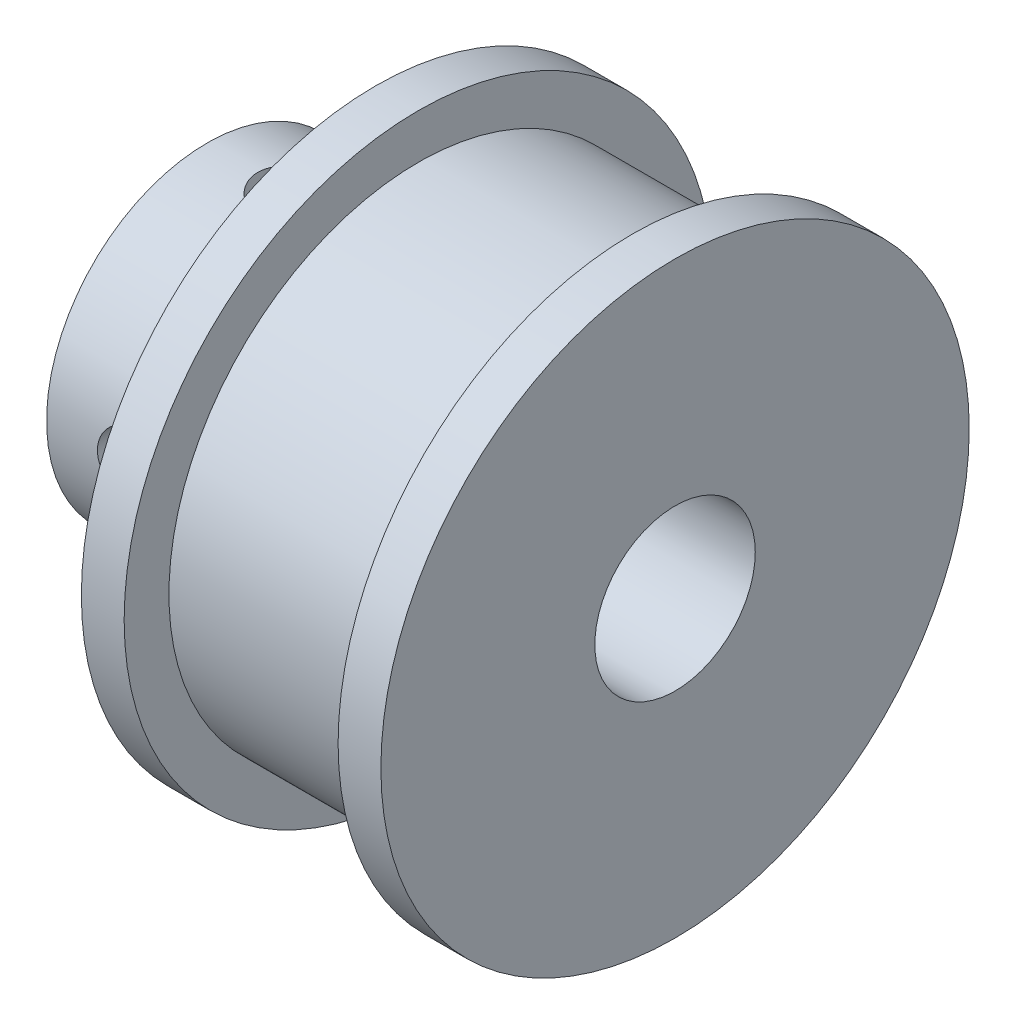
ISO-10303-21;
HEADER;
FILE_DESCRIPTION(('STEP AP214'),'2;1');
FILE_NAME('part.step','',(''),(''),'','','');
FILE_SCHEMA(('AUTOMOTIVE_DESIGN { 1 0 10303 214 1 1 1 1 }'));
ENDSEC;
DATA;
#1=APPLICATION_CONTEXT('core data for automotive mechanical design processes');
#2=APPLICATION_PROTOCOL_DEFINITION('international standard','automotive_design',2000,#1);
#3=PRODUCT_CONTEXT('',#1,'mechanical');
#4=PRODUCT('Part','Part','',(#3));
#5=PRODUCT_RELATED_PRODUCT_CATEGORY('part','',(#4));
#6=PRODUCT_DEFINITION_FORMATION('','',#4);
#7=PRODUCT_DEFINITION_CONTEXT('part definition',#1,'design');
#8=PRODUCT_DEFINITION('design','',#6,#7);
#9=PRODUCT_DEFINITION_SHAPE('','',#8);
#10=(LENGTH_UNIT() NAMED_UNIT(*) SI_UNIT(.MILLI.,.METRE.));
#11=(NAMED_UNIT(*) PLANE_ANGLE_UNIT() SI_UNIT($,.RADIAN.));
#12=(NAMED_UNIT(*) SI_UNIT($,.STERADIAN.) SOLID_ANGLE_UNIT());
#13=UNCERTAINTY_MEASURE_WITH_UNIT(LENGTH_MEASURE(1.E-05),#10,'distance_accuracy_value','');
#14=(GEOMETRIC_REPRESENTATION_CONTEXT(3) GLOBAL_UNCERTAINTY_ASSIGNED_CONTEXT((#13)) GLOBAL_UNIT_ASSIGNED_CONTEXT((#10,
#11,#12)) REPRESENTATION_CONTEXT('',''));
#15=CARTESIAN_POINT('',(0.,0.,0.));
#16=DIRECTION('',(0.,0.,1.));
#17=DIRECTION('',(1.,0.,0.));
#18=AXIS2_PLACEMENT_3D('',#15,#16,#17);
#19=CARTESIAN_POINT('',(0.,2.5,0.));
#20=DIRECTION('',(-1.,0.,0.));
#21=DIRECTION('',(0.,0.,1.));
#22=AXIS2_PLACEMENT_3D('',#19,#20,#21);
#23=PLANE('',#22);
#24=CARTESIAN_POINT('',(0.,0.,0.));
#25=DIRECTION('',(1.,0.,0.));
#26=DIRECTION('',(0.,0.,-1.));
#27=AXIS2_PLACEMENT_3D('',#24,#25,#26);
#28=CIRCLE('',#27,3.);
#29=CARTESIAN_POINT('',(0.,0.,-3.));
#30=VERTEX_POINT('',#29);
#31=EDGE_CURVE('E3315',#30,#30,#28,.T.);
#32=ORIENTED_EDGE('',*,*,#31,.T.);
#33=EDGE_LOOP('',(#32));
#34=FACE_BOUND('',#33,.T.);
#35=CARTESIAN_POINT('',(0.,0.,0.));
#36=DIRECTION('',(1.,0.,0.));
#37=DIRECTION('',(0.,0.,-1.));
#38=AXIS2_PLACEMENT_3D('',#35,#36,#37);
#39=CIRCLE('',#38,6.);
#40=CARTESIAN_POINT('',(0.,0.,-6.));
#41=VERTEX_POINT('',#40);
#42=EDGE_CURVE('E14',#41,#41,#39,.T.);
#43=ORIENTED_EDGE('',*,*,#42,.F.);
#44=EDGE_LOOP('',(#43));
#45=FACE_BOUND('',#44,.T.);
#46=ADVANCED_FACE('F3239',(#34,#45),#23,.T.);
#47=CARTESIAN_POINT('',(0.,0.,0.));
#48=DIRECTION('',(1.,0.,0.));
#49=DIRECTION('',(0.,0.,-1.));
#50=AXIS2_PLACEMENT_3D('',#47,#48,#49);
#51=CYLINDRICAL_SURFACE('',#50,6.);
#52=CARTESIAN_POINT('',(1.90000000000001,0.,6.));
#53=CARTESIAN_POINT('',(1.90000247746923,-0.0694090417016603,5.99999871526651));
#54=CARTESIAN_POINT('',(1.90580066571876,-0.138848789520875,5.99878328775043));
#55=CARTESIAN_POINT('',(1.92881934953286,-0.275761316266992,5.99405200990679));
#56=CARTESIAN_POINT('',(1.94604852303694,-0.343232560128311,5.99053441189248));
#57=CARTESIAN_POINT('',(1.99137045492183,-0.474209132291339,5.98159109196202));
#58=CARTESIAN_POINT('',(2.01945239599889,-0.537718336709182,5.97616727052645));
#59=CARTESIAN_POINT('',(2.08564960885619,-0.659120328605954,5.96399927809859));
#60=CARTESIAN_POINT('',(2.12376443115584,-0.717013367534323,5.95725516625975));
#61=CARTESIAN_POINT('',(2.20953634019065,-0.826390324308832,5.9430770002465));
#62=CARTESIAN_POINT('',(2.25731200123509,-0.87778024416268,5.93563505848531));
#63=CARTESIAN_POINT('',(2.36079465919511,-0.971877776769387,5.92095657692448));
#64=CARTESIAN_POINT('',(2.41650231187227,-1.01458467096098,5.91372005416683));
#65=CARTESIAN_POINT('',(2.53495196876616,-1.09051031677216,5.90019442595308));
#66=CARTESIAN_POINT('',(2.59775838450275,-1.1236305468065,5.89391545174828));
#67=CARTESIAN_POINT('',(2.72819745177276,-1.17881119348063,5.8831284065002));
#68=CARTESIAN_POINT('',(2.79582958244254,-1.20087280167641,5.87862014467568));
#69=CARTESIAN_POINT('',(2.93298523741564,-1.23300240133736,5.87196500986123));
#70=CARTESIAN_POINT('',(3.00246835933477,-1.24323597696798,5.86978556855865));
#71=CARTESIAN_POINT('',(3.14219684286263,-1.25193357655614,5.86793690716491));
#72=CARTESIAN_POINT('',(3.2124421188653,-1.25039890894686,5.86826740800981));
#73=CARTESIAN_POINT('',(3.35048102797518,-1.23573719037196,5.87137174319175));
#74=CARTESIAN_POINT('',(3.41829597966121,-1.2228010523272,5.87410533679901));
#75=CARTESIAN_POINT('',(3.55077150964493,-1.18600543529945,5.88164437615942));
#76=CARTESIAN_POINT('',(3.61543192560633,-1.16214539481381,5.88644992841317));
#77=CARTESIAN_POINT('',(3.74030722841598,-1.10400003213928,5.89763191464102));
#78=CARTESIAN_POINT('',(3.80048629652707,-1.06964002534236,5.90401953785586));
#79=CARTESIAN_POINT('',(3.91429574426816,-0.991522699274812,5.91763890010721));
#80=CARTESIAN_POINT('',(3.96792530883597,-0.947764212262582,5.92487074398537));
#81=CARTESIAN_POINT('',(4.06821396108037,-0.851074921546777,5.93953730929909));
#82=CARTESIAN_POINT('',(4.11471616889701,-0.797981433412077,5.94697323199473));
#83=CARTESIAN_POINT('',(4.19818044222897,-0.684667288611794,5.96108088143001));
#84=CARTESIAN_POINT('',(4.23514236459839,-0.624446525025762,5.96775259670236));
#85=CARTESIAN_POINT('',(4.29851008153595,-0.498405541235475,5.97959870942815));
#86=CARTESIAN_POINT('',(4.32489680456711,-0.432575461926497,5.98477039710258));
#87=CARTESIAN_POINT('',(4.36619170483549,-0.297284620972153,5.99301338211281));
#88=CARTESIAN_POINT('',(4.38110139323139,-0.227824338595088,5.99608495596053));
#89=CARTESIAN_POINT('',(4.39879425206788,-0.0885918657008349,5.99974275215455));
#90=CARTESIAN_POINT('',(4.40179194149424,-0.0188480555261788,6.00037293537579));
#91=CARTESIAN_POINT('',(4.39615505003089,0.120143798757714,5.99919952252774));
#92=CARTESIAN_POINT('',(4.3875211813984,0.189391872962257,5.99739607548153));
#93=CARTESIAN_POINT('',(4.35904434653046,0.324726367119811,5.99158564979184));
#94=CARTESIAN_POINT('',(4.33931251461653,0.390837192894204,5.98760052868077));
#95=CARTESIAN_POINT('',(4.28932213957859,0.518811446661328,5.97787227242395));
#96=CARTESIAN_POINT('',(4.25906275913401,0.580674536336772,5.97212899744579));
#97=CARTESIAN_POINT('',(4.18841962176244,0.69929430694349,5.95941241490714));
#98=CARTESIAN_POINT('',(4.14790807043093,0.755973219469829,5.9524239381233));
#99=CARTESIAN_POINT('',(4.05808043692373,0.861805445886515,5.93802568299709));
#100=CARTESIAN_POINT('',(4.00876332448106,0.910957877913281,5.93061585542511));
#101=CARTESIAN_POINT('',(3.9017444230003,1.0011786486518,5.91606024531377));
#102=CARTESIAN_POINT('',(3.84391696804472,1.04209914600204,5.90892089307501));
#103=CARTESIAN_POINT('',(3.72208371578621,1.11364719079243,5.89585601015805));
#104=CARTESIAN_POINT('',(3.65807817586089,1.14427516677863,5.88993042894651));
#105=CARTESIAN_POINT('',(3.52603880370177,1.19417246443921,5.88001700708041));
#106=CARTESIAN_POINT('',(3.45802896283416,1.21350309828031,5.87601872784687));
#107=CARTESIAN_POINT('',(3.31963344950774,1.24044038523407,5.87039184709697));
#108=CARTESIAN_POINT('',(3.24924811838056,1.2480487154444,5.86876290660367));
#109=CARTESIAN_POINT('',(3.10958659900035,1.25125926487611,5.86807907308506));
#110=CARTESIAN_POINT('',(3.04031592977795,1.24709542622725,5.86897402321502));
#111=CARTESIAN_POINT('',(2.90348599107978,1.22739905314031,5.87312447254928));
#112=CARTESIAN_POINT('',(2.8359267051839,1.21186662782265,5.87637994909626));
#113=CARTESIAN_POINT('',(2.70460222810934,1.16998217768584,5.88486132447716));
#114=CARTESIAN_POINT('',(2.64082675351308,1.14366117568421,5.8900815700793));
#115=CARTESIAN_POINT('',(2.51856122397334,1.08097457299757,5.90190705738738));
#116=CARTESIAN_POINT('',(2.46007166036688,1.04460803983029,5.9085124276546));
#117=CARTESIAN_POINT('',(2.34887837292056,0.962073695342405,5.92251579551146));
#118=CARTESIAN_POINT('',(2.29630087543502,0.91573789041822,5.92992613868404));
#119=CARTESIAN_POINT('',(2.19959050677365,0.814924438115329,5.94461839583213));
#120=CARTESIAN_POINT('',(2.15545958244852,0.760444918832963,5.9519002798488));
#121=CARTESIAN_POINT('',(2.07641142681595,0.644134427507699,5.96561444547637));
#122=CARTESIAN_POINT('',(2.04160632011372,0.582225921521345,5.97203596073244));
#123=CARTESIAN_POINT('',(1.98294977156998,0.453319843998451,5.98319908494092));
#124=CARTESIAN_POINT('',(1.95908875281813,0.386326781907242,5.98794216182101));
#125=CARTESIAN_POINT('',(1.92745972171158,0.266015292900104,5.99432499781443));
#126=CARTESIAN_POINT('',(1.91718123679115,0.213367593727928,5.99644035661395));
#127=CARTESIAN_POINT('',(1.90345054572268,0.107152674176536,5.99927832789758));
#128=CARTESIAN_POINT('',(1.89999808733282,0.0535854878488715,6.00000099184586));
#129=CARTESIAN_POINT('',(1.90000000000001,0.,6.));
#130=B_SPLINE_CURVE_WITH_KNOTS('',3,(#52,#53,#54,#55,#56,#57,#58,#59,#60,#61,#62,#63,#64,#65,
#66,#67,#68,#69,#70,#71,#72,#73,#74,#75,#76,#77,#78,#79,#80,#81,#82,#83,#84,#85,#86,#87,#88,#89,
#90,#91,#92,#93,#94,#95,#96,#97,#98,#99,#100,#101,#102,#103,#104,#105,#106,#107,#108,#109,#110,
#111,#112,#113,#114,#115,#116,#117,#118,#119,#120,#121,#122,#123,#124,#125,#126,#127,#128,#129),
.UNSPECIFIED.,.T.,.F.,(4,2,2,2,2,2,2,2,2,2,2,2,2,2,2,2,2,2,2,2,2,2,2,2,2,2,2,2,2,2,2,2,2,2,2,2,
2,2,4),(0.,0.208031045103182,0.416220199906223,0.624202378825439,0.832175241572985,
1.04287526388122,1.25359271551785,1.46640449178548,1.67919333285489,1.88896575169853,
2.09871484767163,2.30501712129058,2.51133000030278,2.71914592416748,2.92698768368033,
3.13889526355464,3.35080602278216,3.5630972449966,3.77536051045769,3.98378339407673,
4.19219351552275,4.39855286632619,4.60492863390931,4.81401583995734,5.02312752564571,
5.23571263829333,5.44828889851306,5.65970050095022,5.87108185414182,6.07829223291035,
6.28550062281358,6.49211731393252,6.69875319081476,6.90919024830305,7.11967575117366,
7.33258864398252,7.54531486464969,7.70592588477276,7.86653096973387),.UNSPECIFIED.);
#131=CARTESIAN_POINT('',(1.90000000000001,0.,6.));
#132=VERTEX_POINT('',#131);
#133=EDGE_CURVE('E3265',#132,#132,#130,.T.);
#134=ORIENTED_EDGE('',*,*,#133,.F.);
#135=EDGE_LOOP('',(#134));
#136=FACE_BOUND('',#135,.T.);
#137=CARTESIAN_POINT('',(3.15,5.86834729715275,-1.25));
#138=CARTESIAN_POINT('',(3.08060938484897,5.86834869213645,-1.24999750877599));
#139=CARTESIAN_POINT('',(3.01118802798478,5.86959145924544,-1.24420229433948));
#140=CARTESIAN_POINT('',(2.87431368268275,5.87442015581798,-1.22119649233779));
#141=CARTESIAN_POINT('',(2.80686224449358,5.87800788138388,-1.20397715440342));
#142=CARTESIAN_POINT('',(2.67592762716513,5.8871029296193,-1.1586839750723));
#143=CARTESIAN_POINT('',(2.6124404040082,5.89260825706945,-1.13062141248932));
#144=CARTESIAN_POINT('',(2.4910755003544,5.90491581335741,-1.06446988601732));
#145=CARTESIAN_POINT('',(2.43319759326998,5.91171798977622,-1.0263813273582));
#146=CARTESIAN_POINT('',(2.32380462484654,5.92596934661468,-0.940636399466082));
#147=CARTESIAN_POINT('',(2.27238810637353,5.93342614373039,-0.892855554869668));
#148=CARTESIAN_POINT('',(2.1782389313519,5.94807966802575,-0.789351223880636));
#149=CARTESIAN_POINT('',(2.13550691170856,5.95527637609915,-0.733627155456002));
#150=CARTESIAN_POINT('',(2.05955411191714,5.96868135118848,-0.615162052999588));
#151=CARTESIAN_POINT('',(2.02642747353674,5.97487958631242,-0.552359428204941));
#152=CARTESIAN_POINT('',(1.97123394714022,5.98550347343302,-0.421928551006719));
#153=CARTESIAN_POINT('',(1.94916593484647,5.98992930561222,-0.354300789950591));
#154=CARTESIAN_POINT('',(1.91702423888253,5.99645589892179,-0.217162904200502));
#155=CARTESIAN_POINT('',(1.90678398280484,5.99858891959926,-0.147693380916357));
#156=CARTESIAN_POINT('',(1.89806830424298,6.00040112580612,-0.00799184883952432));
#157=CARTESIAN_POINT('',(1.8995916558069,6.0000805670369,0.0622400797368385));
#158=CARTESIAN_POINT('',(1.91423460095674,5.99704658090511,0.200326586199572));
#159=CARTESIAN_POINT('',(1.92717471895812,5.99437018956584,0.268201128726475));
#160=CARTESIAN_POINT('',(1.96399862533131,5.98696720898885,0.400793746289752));
#161=CARTESIAN_POINT('',(1.98788287720308,5.98224053291904,0.465511687511022));
#162=CARTESIAN_POINT('',(2.0460800521255,5.97120767323924,0.590460005384683));
#163=CARTESIAN_POINT('',(2.08046229420966,5.96489104125346,0.65065713498165));
#164=CARTESIAN_POINT('',(2.15862800284042,5.95137300440189,0.764493456510647));
#165=CARTESIAN_POINT('',(2.20241263820613,5.94417148958325,0.818131831816418));
#166=CARTESIAN_POINT('',(2.29912162489106,5.92951700233276,0.918394203276912));
#167=CARTESIAN_POINT('',(2.35220305998195,5.92206184975925,0.964866487494794));
#168=CARTESIAN_POINT('',(2.4654820489948,5.90786872648996,1.04827597240488));
#169=CARTESIAN_POINT('',(2.52567976138724,5.9011307717716,1.0852129606998));
#170=CARTESIAN_POINT('',(2.6517122548288,5.88912998409156,1.14856217138454));
#171=CARTESIAN_POINT('',(2.71756065069343,5.88387085232125,1.17494805489727));
#172=CARTESIAN_POINT('',(2.85289161936939,5.8754760641036,1.21623577538673));
#173=CARTESIAN_POINT('',(2.92237367280809,5.87234010507182,1.23113924882349));
#174=CARTESIAN_POINT('',(3.06161970631891,5.86860783239132,1.24880863867017));
#175=CARTESIAN_POINT('',(3.13135458453703,5.86796551863474,1.25179442917998));
#176=CARTESIAN_POINT('',(3.27032581154014,5.86916952018704,1.24613693439294));
#177=CARTESIAN_POINT('',(3.33956219090234,5.87101568152623,1.23749436857863));
#178=CARTESIAN_POINT('',(3.47482051605812,5.87694538226166,1.20901558325484));
#179=CARTESIAN_POINT('',(3.54086866717883,5.88100511282998,1.18929841376871));
#180=CARTESIAN_POINT('',(3.6687239894416,5.8908833850312,1.13935810860919));
#181=CARTESIAN_POINT('',(3.7305307856504,5.89670208191057,1.10913404556146));
#182=CARTESIAN_POINT('',(3.84910644121623,5.90954501937191,1.03854598181485));
#183=CARTESIAN_POINT('',(3.90579220446617,5.91658506648323,0.998045327353962));
#184=CARTESIAN_POINT('',(4.01164324915506,5.93103483993908,0.908234440569878));
#185=CARTESIAN_POINT('',(4.06080768623923,5.93844460766532,0.858923220505172));
#186=CARTESIAN_POINT('',(4.15106271309716,5.95294924316736,0.751900450843339));
#187=CARTESIAN_POINT('',(4.19200409502638,5.9600367471991,0.694061907614551));
#188=CARTESIAN_POINT('',(4.26358875208798,5.97296708772407,0.57220010221636));
#189=CARTESIAN_POINT('',(4.29423248223745,5.97880997920818,0.508177113476881));
#190=CARTESIAN_POINT('',(4.34413867931735,5.98856148270679,0.376142117847919));
#191=CARTESIAN_POINT('',(4.36346916554434,5.99248163136497,0.308156710970195));
#192=CARTESIAN_POINT('',(4.3904144040081,5.99799561410226,0.169813400503473));
#193=CARTESIAN_POINT('',(4.39803069353274,5.99958975342889,0.0994558094616958));
#194=CARTESIAN_POINT('',(4.40126762204851,6.00026408056941,-0.0402133434703387));
#195=CARTESIAN_POINT('',(4.39711189999473,5.99939113754811,-0.109519592177922));
#196=CARTESIAN_POINT('',(4.37741936134707,5.99532874094472,-0.246422870373552));
#197=CARTESIAN_POINT('',(4.36188271359323,5.99213932172839,-0.314019925202702));
#198=CARTESIAN_POINT('',(4.31997220535144,5.98380460077544,-0.445431965492052));
#199=CARTESIAN_POINT('',(4.29362733614689,5.97866453407556,-0.509256550004524));
#200=CARTESIAN_POINT('',(4.230877602268,5.96697995347704,-0.631610567220741));
#201=CARTESIAN_POINT('',(4.19447186165686,5.96043531730246,-0.690139538279511));
#202=CARTESIAN_POINT('',(4.11189033200669,5.94651596786386,-0.80134032129826));
#203=CARTESIAN_POINT('',(4.0655557119433,5.93912880302851,-0.853892633615926));
#204=CARTESIAN_POINT('',(3.96475549900292,5.9244278681135,-0.950552741980385));
#205=CARTESIAN_POINT('',(3.91028797005157,5.91711411595368,-0.994658521571232));
#206=CARTESIAN_POINT('',(3.79399089756656,5.90329191643327,-1.07367451852767));
#207=CARTESIAN_POINT('',(3.73208158853791,5.89679406702551,-1.10846928126994));
#208=CARTESIAN_POINT('',(3.60317484391674,5.88547039658063,-1.16710627925306));
#209=CARTESIAN_POINT('',(3.53618195154699,5.88064310352601,-1.1909581629246));
#210=CARTESIAN_POINT('',(3.41589371843157,5.87414004405196,-1.22256554131861));
#211=CARTESIAN_POINT('',(3.36327046340695,5.87198163591589,-1.2328344900567));
#212=CARTESIAN_POINT('',(3.25710421947899,5.86908475266778,-1.24655254358404));
#213=CARTESIAN_POINT('',(3.20356126768996,5.86834622039193,-1.25000192292741));
#214=CARTESIAN_POINT('',(3.15,5.86834729715275,-1.25));
#215=B_SPLINE_CURVE_WITH_KNOTS('',3,(#137,#138,#139,#140,#141,#142,#143,#144,#145,#146,#147,
#148,#149,#150,#151,#152,#153,#154,#155,#156,#157,#158,#159,#160,#161,#162,#163,#164,#165,#166,
#167,#168,#169,#170,#171,#172,#173,#174,#175,#176,#177,#178,#179,#180,#181,#182,#183,#184,#185,
#186,#187,#188,#189,#190,#191,#192,#193,#194,#195,#196,#197,#198,#199,#200,#201,#202,#203,#204,
#205,#206,#207,#208,#209,#210,#211,#212,#213,#214),.UNSPECIFIED.,.T.,.F.,(4,2,2,2,2,2,2,2,2,2,2,
2,2,2,2,2,2,2,2,2,2,2,2,2,2,2,2,2,2,2,2,2,2,2,2,2,2,2,4),(0.,0.207975654071269,0.41611079241747,
0.624030014802729,0.831940834815791,1.04271333467885,1.25350128663874,1.46629026266844,
1.67905760106933,1.88879048859264,2.09850151896339,2.30497341416461,2.5114540545587,
2.71932871977949,2.9272292410426,3.13905862244913,3.35089272191628,3.56325237332487,
3.77558175387597,3.98397516009792,4.19235567296524,4.39853786231922,4.60473825464031,
4.81383917934651,5.02296356082185,5.23559458753343,5.4482162175904,5.65954599648534,
5.87084803959581,6.07816293922644,6.28547476332981,6.492234105851,6.69901145528173,
6.90938318978573,7.11980508427535,7.33272651358123,7.54545984571988,7.70599867585769,
7.8665310426116),.UNSPECIFIED.);
#216=CARTESIAN_POINT('',(3.15,5.86834729715275,-1.25));
#217=VERTEX_POINT('',#216);
#218=EDGE_CURVE('E3259',#217,#217,#215,.T.);
#219=ORIENTED_EDGE('',*,*,#218,.F.);
#220=EDGE_LOOP('',(#219));
#221=FACE_BOUND('',#220,.T.);
#222=ORIENTED_EDGE('',*,*,#42,.T.);
#223=EDGE_LOOP('',(#222));
#224=FACE_BOUND('',#223,.T.);
#225=CARTESIAN_POINT('',(6.3,0.,0.));
#226=DIRECTION('',(1.,0.,0.));
#227=DIRECTION('',(0.,0.,-1.));
#228=AXIS2_PLACEMENT_3D('',#225,#226,#227);
#229=CIRCLE('',#228,6.);
#230=CARTESIAN_POINT('',(6.3,0.,-6.));
#231=VERTEX_POINT('',#230);
#232=EDGE_CURVE('E3250',#231,#231,#229,.T.);
#233=ORIENTED_EDGE('',*,*,#232,.F.);
#234=EDGE_LOOP('',(#233));
#235=FACE_BOUND('',#234,.T.);
#236=ADVANCED_FACE('F3268',(#136,#221,#224,#235),#51,.T.);
#237=CARTESIAN_POINT('',(6.3,11.,0.));
#238=DIRECTION('',(-1.,0.,0.));
#239=DIRECTION('',(0.,0.,1.));
#240=AXIS2_PLACEMENT_3D('',#237,#238,#239);
#241=PLANE('',#240);
#242=ORIENTED_EDGE('',*,*,#232,.T.);
#243=EDGE_LOOP('',(#242));
#244=FACE_BOUND('',#243,.T.);
#245=CARTESIAN_POINT('',(6.3,0.,0.));
#246=DIRECTION('',(1.,0.,0.));
#247=DIRECTION('',(0.,0.,-1.));
#248=AXIS2_PLACEMENT_3D('',#245,#246,#247);
#249=CIRCLE('',#248,11.);
#250=CARTESIAN_POINT('',(6.3,0.,-11.));
#251=VERTEX_POINT('',#250);
#252=EDGE_CURVE('E3255',#251,#251,#249,.T.);
#253=ORIENTED_EDGE('',*,*,#252,.F.);
#254=EDGE_LOOP('',(#253));
#255=FACE_BOUND('',#254,.T.);
#256=ADVANCED_FACE('F3310',(#244,#255),#241,.T.);
#257=CARTESIAN_POINT('',(0.,0.,0.));
#258=DIRECTION('',(1.,0.,0.));
#259=DIRECTION('',(0.,0.,-1.));
#260=AXIS2_PLACEMENT_3D('',#257,#258,#259);
#261=CYLINDRICAL_SURFACE('',#260,11.);
#262=ORIENTED_EDGE('',*,*,#252,.T.);
#263=EDGE_LOOP('',(#262));
#264=FACE_BOUND('',#263,.T.);
#265=CARTESIAN_POINT('',(7.9,0.,0.));
#266=DIRECTION('',(1.,0.,0.));
#267=DIRECTION('',(0.,0.,-1.));
#268=AXIS2_PLACEMENT_3D('',#265,#266,#267);
#269=CIRCLE('',#268,11.);
#270=CARTESIAN_POINT('',(7.9,0.,-11.));
#271=VERTEX_POINT('',#270);
#272=EDGE_CURVE('E3338',#271,#271,#269,.T.);
#273=ORIENTED_EDGE('',*,*,#272,.F.);
#274=EDGE_LOOP('',(#273));
#275=FACE_BOUND('',#274,.T.);
#276=ADVANCED_FACE('F3343',(#264,#275),#261,.T.);
#277=CARTESIAN_POINT('',(7.9,11.,0.));
#278=DIRECTION('',(1.,0.,0.));
#279=DIRECTION('',(0.,0.,-1.));
#280=AXIS2_PLACEMENT_3D('',#277,#278,#279);
#281=PLANE('',#280);
#282=ORIENTED_EDGE('',*,*,#272,.T.);
#283=EDGE_LOOP('',(#282));
#284=FACE_BOUND('',#283,.T.);
#285=CARTESIAN_POINT('',(7.9,0.,0.));
#286=DIRECTION('',(1.,0.,0.));
#287=DIRECTION('',(0.,0.,-1.));
#288=AXIS2_PLACEMENT_3D('',#285,#286,#287);
#289=CIRCLE('',#288,9.325);
#290=CARTESIAN_POINT('',(7.9,0.,-9.325));
#291=VERTEX_POINT('',#290);
#292=EDGE_CURVE('E3333',#291,#291,#289,.T.);
#293=ORIENTED_EDGE('',*,*,#292,.F.);
#294=EDGE_LOOP('',(#293));
#295=FACE_BOUND('',#294,.T.);
#296=ADVANCED_FACE('F3351',(#284,#295),#281,.T.);
#297=CARTESIAN_POINT('',(0.,0.,0.));
#298=DIRECTION('',(1.,0.,0.));
#299=DIRECTION('',(0.,0.,-1.));
#300=AXIS2_PLACEMENT_3D('',#297,#298,#299);
#301=CYLINDRICAL_SURFACE('',#300,9.325);
#302=ORIENTED_EDGE('',*,*,#292,.T.);
#303=EDGE_LOOP('',(#302));
#304=FACE_BOUND('',#303,.T.);
#305=CARTESIAN_POINT('',(15.9,0.,0.));
#306=DIRECTION('',(1.,0.,0.));
#307=DIRECTION('',(0.,0.,-1.));
#308=AXIS2_PLACEMENT_3D('',#305,#306,#307);
#309=CIRCLE('',#308,9.325);
#310=CARTESIAN_POINT('',(15.9,0.,-9.325));
#311=VERTEX_POINT('',#310);
#312=EDGE_CURVE('E3329',#311,#311,#309,.T.);
#313=ORIENTED_EDGE('',*,*,#312,.F.);
#314=EDGE_LOOP('',(#313));
#315=FACE_BOUND('',#314,.T.);
#316=ADVANCED_FACE('F3356',(#304,#315),#301,.T.);
#317=CARTESIAN_POINT('',(15.9,9.325,0.));
#318=DIRECTION('',(-1.,0.,0.));
#319=DIRECTION('',(0.,0.,1.));
#320=AXIS2_PLACEMENT_3D('',#317,#318,#319);
#321=PLANE('',#320);
#322=ORIENTED_EDGE('',*,*,#312,.T.);
#323=EDGE_LOOP('',(#322));
#324=FACE_BOUND('',#323,.T.);
#325=CARTESIAN_POINT('',(15.9,0.,0.));
#326=DIRECTION('',(1.,0.,0.));
#327=DIRECTION('',(0.,0.,-1.));
#328=AXIS2_PLACEMENT_3D('',#325,#326,#327);
#329=CIRCLE('',#328,11.);
#330=CARTESIAN_POINT('',(15.9,0.,-11.));
#331=VERTEX_POINT('',#330);
#332=EDGE_CURVE('E3327',#331,#331,#329,.T.);
#333=ORIENTED_EDGE('',*,*,#332,.F.);
#334=EDGE_LOOP('',(#333));
#335=FACE_BOUND('',#334,.T.);
#336=ADVANCED_FACE('F3360',(#324,#335),#321,.T.);
#337=CARTESIAN_POINT('',(0.,0.,0.));
#338=DIRECTION('',(1.,0.,0.));
#339=DIRECTION('',(0.,0.,-1.));
#340=AXIS2_PLACEMENT_3D('',#337,#338,#339);
#341=CYLINDRICAL_SURFACE('',#340,11.);
#342=ORIENTED_EDGE('',*,*,#332,.T.);
#343=EDGE_LOOP('',(#342));
#344=FACE_BOUND('',#343,.T.);
#345=CARTESIAN_POINT('',(17.5,0.,0.));
#346=DIRECTION('',(1.,0.,0.));
#347=DIRECTION('',(0.,0.,-1.));
#348=AXIS2_PLACEMENT_3D('',#345,#346,#347);
#349=CIRCLE('',#348,11.);
#350=CARTESIAN_POINT('',(17.5,0.,-11.));
#351=VERTEX_POINT('',#350);
#352=EDGE_CURVE('E3264',#351,#351,#349,.T.);
#353=ORIENTED_EDGE('',*,*,#352,.F.);
#354=EDGE_LOOP('',(#353));
#355=FACE_BOUND('',#354,.T.);
#356=ADVANCED_FACE('F3323',(#344,#355),#341,.T.);
#357=CARTESIAN_POINT('',(17.5,11.,0.));
#358=DIRECTION('',(1.,0.,0.));
#359=DIRECTION('',(0.,0.,-1.));
#360=AXIS2_PLACEMENT_3D('',#357,#358,#359);
#361=PLANE('',#360);
#362=CARTESIAN_POINT('',(17.5,0.,0.));
#363=DIRECTION('',(1.,0.,0.));
#364=DIRECTION('',(0.,0.,-1.));
#365=AXIS2_PLACEMENT_3D('',#362,#363,#364);
#366=CIRCLE('',#365,3.);
#367=CARTESIAN_POINT('',(17.5,0.,-3.));
#368=VERTEX_POINT('',#367);
#369=EDGE_CURVE('E3288',#368,#368,#366,.T.);
#370=ORIENTED_EDGE('',*,*,#369,.F.);
#371=EDGE_LOOP('',(#370));
#372=FACE_BOUND('',#371,.T.);
#373=ORIENTED_EDGE('',*,*,#352,.T.);
#374=EDGE_LOOP('',(#373));
#375=FACE_BOUND('',#374,.T.);
#376=ADVANCED_FACE('F3276',(#372,#375),#361,.T.);
#377=CARTESIAN_POINT('',(3.15,0.,0.));
#378=DIRECTION('',(0.,-1.,0.));
#379=DIRECTION('',(0.,0.,-1.));
#380=AXIS2_PLACEMENT_3D('',#377,#378,#379);
#381=CYLINDRICAL_SURFACE('',#380,1.25);
#382=CARTESIAN_POINT('',(3.15,2.72717802865893,-1.25));
#383=CARTESIAN_POINT('',(3.21667189089685,2.72718519563219,-1.24999259066567));
#384=CARTESIAN_POINT('',(3.28345265682622,2.729658595344,-1.24463203881503));
#385=CARTESIAN_POINT('',(3.41508694205714,2.73923833650884,-1.22339678947785));
#386=CARTESIAN_POINT('',(3.47993472667524,2.74635725824267,-1.20749354003276));
#387=CARTESIAN_POINT('',(3.60556112969108,2.76426917574768,-1.16589988419451));
#388=CARTESIAN_POINT('',(3.66635516371502,2.77504717562616,-1.14024937431428));
#389=CARTESIAN_POINT('',(3.78275944957805,2.79904148565793,-1.08000637754463));
#390=CARTESIAN_POINT('',(3.83837092343312,2.81225721880783,-1.04541600591531));
#391=CARTESIAN_POINT('',(3.94632572497347,2.84055762619857,-0.965973882676165));
#392=CARTESIAN_POINT('',(3.99830755874409,2.85570568079146,-0.920653238184408));
#393=CARTESIAN_POINT('',(4.09420022249756,2.88564295372227,-0.82202167574555));
#394=CARTESIAN_POINT('',(4.13810794061301,2.90043203180789,-0.768707691374004));
#395=CARTESIAN_POINT('',(4.21844953087928,2.92875537930613,-0.652763393797348));
#396=CARTESIAN_POINT('',(4.25447662803235,2.94220739975291,-0.589829293683659));
#397=CARTESIAN_POINT('',(4.31527602050561,2.96556519993426,-0.458132022362352));
#398=CARTESIAN_POINT('',(4.34005331196422,2.97547255347157,-0.389371454872124));
#399=CARTESIAN_POINT('',(4.37633945875674,2.99017521042367,-0.251768498025165));
#400=CARTESIAN_POINT('',(4.38847169490205,2.99520971127466,-0.18311657619608));
#401=CARTESIAN_POINT('',(4.40113764115986,3.00046828611204,-0.0445791803650059));
#402=CARTESIAN_POINT('',(4.40167605588296,3.00069431131015,0.0253057817645164));
#403=CARTESIAN_POINT('',(4.39146571906668,2.99645129133057,0.159792780112568));
#404=CARTESIAN_POINT('',(4.38140189947427,2.99226714648664,0.224457488607313));
#405=CARTESIAN_POINT('',(4.35144689736184,2.98006516750309,0.351082893931456));
#406=CARTESIAN_POINT('',(4.33155499036984,2.97204705074577,0.413043391054916));
#407=CARTESIAN_POINT('',(4.28227195910536,2.95279852414029,0.533638118077525));
#408=CARTESIAN_POINT('',(4.25274053712918,2.94152097126085,0.592207177074906));
#409=CARTESIAN_POINT('',(4.18515424329966,2.91685713989805,0.703711767281963));
#410=CARTESIAN_POINT('',(4.14709635915502,2.90347011666255,0.756645297756974));
#411=CARTESIAN_POINT('',(4.06041757959538,2.87481698777061,0.859340911707924));
#412=CARTESIAN_POINT('',(4.01124120872099,2.8594849435601,0.90861643731624));
#413=CARTESIAN_POINT('',(3.90528855929342,2.8293786068147,0.998431414927667));
#414=CARTESIAN_POINT('',(3.84850936170791,2.8146045313137,1.03896749582431));
#415=CARTESIAN_POINT('',(3.72660496333809,2.78681612355338,1.11140189250063));
#416=CARTESIAN_POINT('',(3.66126679425672,2.77387558556714,1.1429725335554));
#417=CARTESIAN_POINT('',(3.5255189550255,2.75209844221011,1.19446432058391));
#418=CARTESIAN_POINT('',(3.45511295173046,2.74325890334594,1.21439379627313));
#419=CARTESIAN_POINT('',(3.316103191086,2.73141212519724,1.24080025168121));
#420=CARTESIAN_POINT('',(3.24767887774095,2.72806369197117,1.24806614632866));
#421=CARTESIAN_POINT('',(3.1105215175885,2.72660286810642,1.25125630518999));
#422=CARTESIAN_POINT('',(3.04178858580829,2.72848866599319,1.24718449318149));
#423=CARTESIAN_POINT('',(2.91060161456955,2.73693131345749,1.22853477565556));
#424=CARTESIAN_POINT('',(2.8480273132132,2.74318138016618,1.21464618818048));
#425=CARTESIAN_POINT('',(2.72614870350213,2.75925630297447,1.17767058564225));
#426=CARTESIAN_POINT('',(2.66684516316929,2.76908199460161,1.15458142053125));
#427=CARTESIAN_POINT('',(2.55038468964353,2.79170797857,1.09877520805186));
#428=CARTESIAN_POINT('',(2.49342502538968,2.80461662202282,1.06569183306198));
#429=CARTESIAN_POINT('',(2.38559194750098,2.83180003740794,0.991200784385969));
#430=CARTESIAN_POINT('',(2.33472118329813,2.84607539920583,0.949789507875986));
#431=CARTESIAN_POINT('',(2.236199865116,2.87578619784532,0.855844455715504));
#432=CARTESIAN_POINT('',(2.18914860004934,2.89122146708842,0.802679661479737));
#433=CARTESIAN_POINT('',(2.10452770802067,2.92043361183923,0.688851512553538));
#434=CARTESIAN_POINT('',(2.0669587759363,2.93421036577013,0.628187608803656));
#435=CARTESIAN_POINT('',(2.00241012455643,2.9586425158565,0.500654680803384));
#436=CARTESIAN_POINT('',(1.97545775871052,2.96928983138826,0.433770169638506));
#437=CARTESIAN_POINT('',(1.93338320766557,2.98618173103366,0.295858835154416));
#438=CARTESIAN_POINT('',(1.91825398177394,2.9924289351992,0.224834504225195));
#439=CARTESIAN_POINT('',(1.9011418744797,2.9995153479751,0.086016533506411));
#440=CARTESIAN_POINT('',(1.89831400030304,3.00070204534225,0.0183440847938977));
#441=CARTESIAN_POINT('',(1.90361314129394,2.99849523480953,-0.116486811714285));
#442=CARTESIAN_POINT('',(1.91173823601287,2.99510252984313,-0.183645347541155));
#443=CARTESIAN_POINT('',(1.93810607215866,2.98430065981734,-0.313086482449184));
#444=CARTESIAN_POINT('',(1.95597968046955,2.97703824209233,-0.375457537843569));
#445=CARTESIAN_POINT('',(2.00093424720913,2.95929499847058,-0.496292230501331));
#446=CARTESIAN_POINT('',(2.02801695466491,2.94881356124207,-0.554755122985826));
#447=CARTESIAN_POINT('',(2.09198952921447,2.92505825398662,-0.669024565478781));
#448=CARTESIAN_POINT('',(2.12926730142399,2.91167959188766,-0.724591657976682));
#449=CARTESIAN_POINT('',(2.21200718287189,2.88371561874231,-0.828918675638781));
#450=CARTESIAN_POINT('',(2.25747233040675,2.86912986083797,-0.877676061786042));
#451=CARTESIAN_POINT('',(2.35894482585441,2.83914845259141,-0.97044978723158));
#452=CARTESIAN_POINT('',(2.41545901462112,2.82376522857896,-1.01391775364847));
#453=CARTESIAN_POINT('',(2.5354587406802,2.79495552690186,-1.09083332306674));
#454=CARTESIAN_POINT('',(2.59894814805814,2.78153014522558,-1.12427532456755));
#455=CARTESIAN_POINT('',(2.73094383502275,2.75842557732642,-1.17982766043577));
#456=CARTESIAN_POINT('',(2.79942115879321,2.74872654469865,-1.20199823632854));
#457=CARTESIAN_POINT('',(2.93953957385067,2.73440803066667,-1.23423556453801));
#458=CARTESIAN_POINT('',(3.0111692072743,2.72977151604981,-1.2443429152121));
#459=CARTESIAN_POINT('',(3.10535852426189,2.72744979732688,-1.2494046492365));
#460=CARTESIAN_POINT('',(3.12767315738804,2.72717562860875,-1.25000248121118));
#461=CARTESIAN_POINT('',(3.15,2.72717802865893,-1.25));
#462=B_SPLINE_CURVE_WITH_KNOTS('',3,(#382,#383,#384,#385,#386,#387,#388,#389,#390,#391,#392,
#393,#394,#395,#396,#397,#398,#399,#400,#401,#402,#403,#404,#405,#406,#407,#408,#409,#410,#411,
#412,#413,#414,#415,#416,#417,#418,#419,#420,#421,#422,#423,#424,#425,#426,#427,#428,#429,#430,
#431,#432,#433,#434,#435,#436,#437,#438,#439,#440,#441,#442,#443,#444,#445,#446,#447,#448,#449,
#450,#451,#452,#453,#454,#455,#456,#457,#458,#459,#460,#461),.UNSPECIFIED.,.T.,.F.,(4,2,2,2,2,2,
2,2,2,2,2,2,2,2,2,2,2,2,2,2,2,2,2,2,2,2,2,2,2,2,2,2,2,2,2,2,2,2,2,4),(0.,0.199951711985515,
0.400447161842175,0.600130652152111,0.7997669385501,1.01066841430654,1.2216510045991,
1.44178476577924,1.66182066774891,1.87040605977952,2.0789068091793,2.27471840245093,
2.47054443201883,2.66935814640065,2.86824221022484,3.08114531844484,3.29413040441366,
3.51411545666722,3.73394290745569,3.93950778306307,4.14500152518448,4.33733901066192,
4.52972146913529,4.73025126818169,4.93086800795465,5.14781662735513,5.36478114041866,
5.58230105955594,5.79969134643007,6.00188635094053,6.20404590801914,6.39903415036487,
6.59405944632172,6.79789862829036,7.00181361048904,7.21960426908077,7.43751638139188,
7.65425125796865,7.87025464546162,7.93721375436705),.UNSPECIFIED.);
#463=CARTESIAN_POINT('',(3.15,2.72717802865893,-1.25));
#464=VERTEX_POINT('',#463);
#465=EDGE_CURVE('E3282',#464,#464,#462,.T.);
#466=ORIENTED_EDGE('',*,*,#465,.T.);
#467=EDGE_LOOP('',(#466));
#468=FACE_BOUND('',#467,.T.);
#469=ORIENTED_EDGE('',*,*,#218,.T.);
#470=EDGE_LOOP('',(#469));
#471=FACE_BOUND('',#470,.T.);
#472=ADVANCED_FACE('F3271',(#468,#471),#381,.F.);
#473=CARTESIAN_POINT('',(3.15,0.,0.));
#474=DIRECTION('',(0.,0.,-1.));
#475=DIRECTION('',(-1.,0.,0.));
#476=AXIS2_PLACEMENT_3D('',#473,#474,#475);
#477=CYLINDRICAL_SURFACE('',#476,1.24999999999999);
#478=CARTESIAN_POINT('',(1.90000000000001,0.,3.));
#479=CARTESIAN_POINT('',(1.90000720509131,0.0669580526362665,2.99999458367273));
#480=CARTESIAN_POINT('',(1.90541195852814,0.13402139706384,2.9977323297471));
#481=CARTESIAN_POINT('',(1.92683906492019,0.266247371156346,2.98890153579552));
#482=CARTESIAN_POINT('',(1.94288912446426,0.331404576423563,2.98232175901028));
#483=CARTESIAN_POINT('',(1.9849110917806,0.457688733653086,2.96556289038127));
#484=CARTESIAN_POINT('',(2.01084938946816,0.518828524426266,2.95539599975004));
#485=CARTESIAN_POINT('',(2.07177282323257,0.635829756679799,2.93245286470664));
#486=CARTESIAN_POINT('',(2.10675521897087,0.691692790015936,2.91967741092849));
#487=CARTESIAN_POINT('',(2.18662898259089,0.799448403559508,2.89207828351869));
#488=CARTESIAN_POINT('',(2.23190130878976,0.851041267517764,2.87718753326093));
#489=CARTESIAN_POINT('',(2.33026433478258,0.946159821091257,2.84732714068514));
#490=CARTESIAN_POINT('',(2.38335912489451,0.98968126315308,2.8323574610681));
#491=CARTESIAN_POINT('',(2.4990267775649,1.06953737697065,2.80321021812995));
#492=CARTESIAN_POINT('',(2.56193744842655,1.10541308153924,2.78910786873385));
#493=CARTESIAN_POINT('',(2.69357325792093,1.16593940588865,2.76435572357005));
#494=CARTESIAN_POINT('',(2.76229537948446,1.1905958083629,2.75370415000824));
#495=CARTESIAN_POINT('',(2.90015369176792,1.22674598312158,2.73778555387705));
#496=CARTESIAN_POINT('',(2.96911048339216,1.23881657877605,2.73228387651787));
#497=CARTESIAN_POINT('',(3.10827329268657,1.25125209967796,2.72661326219504));
#498=CARTESIAN_POINT('',(3.17847860002574,1.25162348054397,2.7264413842526));
#499=CARTESIAN_POINT('',(3.31240006043494,1.24108450363673,2.73125119560853));
#500=CARTESIAN_POINT('',(3.37620109656446,1.231036811123,2.73583882723623));
#501=CARTESIAN_POINT('',(3.50111209100039,1.20139191015776,2.74898482773797));
#502=CARTESIAN_POINT('',(3.56222153149177,1.18179287287176,2.75754395703564));
#503=CARTESIAN_POINT('',(3.68155770299144,1.1332195872757,2.77786184772757));
#504=CARTESIAN_POINT('',(3.73969542091338,1.10405471539235,2.78968481949136));
#505=CARTESIAN_POINT('',(3.85047773388014,1.03731242580562,2.81518331141086));
#506=CARTESIAN_POINT('',(3.90312015061352,0.999731690519538,2.8288595612978));
#507=CARTESIAN_POINT('',(4.00609995873284,0.91349596554383,2.85792976877979));
#508=CARTESIAN_POINT('',(4.05586656738543,0.864173483207521,2.87337121404473));
#509=CARTESIAN_POINT('',(4.14661350295918,0.757729591051507,2.90325673112529));
#510=CARTESIAN_POINT('',(4.18759177169217,0.700606359448452,2.9177005687701));
#511=CARTESIAN_POINT('',(4.26043582361626,0.578447948693372,2.94438283556473));
#512=CARTESIAN_POINT('',(4.29206944515068,0.513260582447676,2.95656266543334));
#513=CARTESIAN_POINT('',(4.34372113960325,0.377852402526829,2.97689481414803));
#514=CARTESIAN_POINT('',(4.36374563194381,0.307634394795033,2.985049358458));
#515=CARTESIAN_POINT('',(4.39041599212663,0.168928113346227,2.99599641186385));
#516=CARTESIAN_POINT('',(4.39782785744374,0.100611285278638,2.99909541047125));
#517=CARTESIAN_POINT('',(4.40134622361409,-0.0363546554960893,3.00056050368745));
#518=CARTESIAN_POINT('',(4.39745597025199,-0.105003667152636,2.99892795711939));
#519=CARTESIAN_POINT('',(4.37902891519393,-0.237098242341434,2.9913121765694));
#520=CARTESIAN_POINT('',(4.3650300459028,-0.300632966639385,2.9855488728399));
#521=CARTESIAN_POINT('',(4.32753180545921,-0.424382748971089,2.97048606772414));
#522=CARTESIAN_POINT('',(4.30403123404969,-0.484597386518359,2.96118611959704));
#523=CARTESIAN_POINT('',(4.24742902428788,-0.602108999869134,2.93958270645166));
#524=CARTESIAN_POINT('',(4.21405181685396,-0.659257236855321,2.92719491469281));
#525=CARTESIAN_POINT('',(4.1389466222083,-0.767346216231426,2.9007380457909));
#526=CARTESIAN_POINT('',(4.09721514847072,-0.818284352601938,2.88666826768733));
#527=CARTESIAN_POINT('',(4.00309676672759,-0.91633343027426,2.85712087895438));
#528=CARTESIAN_POINT('',(3.95016149701373,-0.962910697979831,2.84161451591029));
#529=CARTESIAN_POINT('',(3.8369787240646,-1.0466698461055,2.81184336768005));
#530=CARTESIAN_POINT('',(3.77672956482826,-1.08384959285617,2.79757886493439));
#531=CARTESIAN_POINT('',(3.64938582469742,-1.14815960208699,2.77181386243988));
#532=CARTESIAN_POINT('',(3.58220596448517,-1.17513918237328,2.76035562555112));
#533=CARTESIAN_POINT('',(3.44362940618989,-1.21717413951572,2.74208355658957));
#534=CARTESIAN_POINT('',(3.37223623751665,-1.23223934863687,2.73526589555752));
#535=CARTESIAN_POINT('',(3.23318130080079,-1.249040803489,2.72763164537264));
#536=CARTESIAN_POINT('',(3.16565533770738,-1.25171380413129,2.72639350967163));
#537=CARTESIAN_POINT('',(3.0311571388589,-1.24615575523912,2.72893853011024));
#538=CARTESIAN_POINT('',(2.96418481968631,-1.23792637964721,2.73272091540307));
#539=CARTESIAN_POINT('',(2.83590725253111,-1.21158404780491,2.74449551302268));
#540=CARTESIAN_POINT('',(2.77448332653661,-1.19394903571465,2.75228354846481));
#541=CARTESIAN_POINT('',(2.65545197864277,-1.14976328202134,2.77103181199189));
#542=CARTESIAN_POINT('',(2.59784563460122,-1.12321003517251,2.78199293131694));
#543=CARTESIAN_POINT('',(2.48430410405088,-1.06010285935489,2.80666954560013));
#544=CARTESIAN_POINT('',(2.42867766983171,-1.02304360910483,2.8205110271368));
#545=CARTESIAN_POINT('',(2.32413986063932,-0.940684072630384,2.8490368905384));
#546=CARTESIAN_POINT('',(2.27523082439943,-0.895380928905612,2.86372156345875));
#547=CARTESIAN_POINT('',(2.18185131831526,-0.793902045778814,2.89356392850106));
#548=CARTESIAN_POINT('',(2.13796356715935,-0.737174739949021,2.90867817511792));
#549=CARTESIAN_POINT('',(2.06030054645638,-0.616600079253193,2.9366014362202));
#550=CARTESIAN_POINT('',(2.02652988511045,-0.55274949794574,2.94940939916741));
#551=CARTESIAN_POINT('',(1.97079015456012,-0.420732056717945,2.97109183362461));
#552=CARTESIAN_POINT('',(1.94863523338271,-0.352653990980631,2.98002782581964));
#553=CARTESIAN_POINT('',(1.91629367092217,-0.213410421846554,2.99321009768625));
#554=CARTESIAN_POINT('',(1.90606955747012,-0.142255316980954,2.99747105811967));
#555=CARTESIAN_POINT('',(1.90066683891356,-0.0472360819191815,2.99972287568934));
#556=CARTESIAN_POINT('',(1.89999745785078,-0.0236245946756562,3.00000191102536));
#557=CARTESIAN_POINT('',(1.90000000000001,0.,3.));
#558=B_SPLINE_CURVE_WITH_KNOTS('',3,(#478,#479,#480,#481,#482,#483,#484,#485,#486,#487,#488,
#489,#490,#491,#492,#493,#494,#495,#496,#497,#498,#499,#500,#501,#502,#503,#504,#505,#506,#507,
#508,#509,#510,#511,#512,#513,#514,#515,#516,#517,#518,#519,#520,#521,#522,#523,#524,#525,#526,
#527,#528,#529,#530,#531,#532,#533,#534,#535,#536,#537,#538,#539,#540,#541,#542,#543,#544,#545,
#546,#547,#548,#549,#550,#551,#552,#553,#554,#555,#556,#557),.UNSPECIFIED.,.T.,.F.,(4,2,2,2,2,2,
2,2,2,2,2,2,2,2,2,2,2,2,2,2,2,2,2,2,2,2,2,2,2,2,2,2,2,2,2,2,2,2,2,4),(0.,0.200806918883938,
0.402138540628695,0.602791851906298,0.80338443685297,1.01317936288806,1.22308438131465,
1.44331724539125,1.66343646730587,1.87295273137556,2.08235338249045,2.27570157202555,
2.46908679727211,2.66658713058713,2.86416545717205,3.07844141127895,3.29276749314586,
3.51204055060811,3.73119224218295,3.93648443393249,4.1417176749317,4.33676589735719,
4.53183876601783,4.73297135272159,4.93418805469493,5.14978488029292,5.36543061240338,
5.58414788359521,5.80268447074577,6.0043987755964,6.20608211297533,6.39837649964759,
6.59072494950609,6.79463893397438,6.9986237342594,7.21746535004885,7.43640649428578,
7.65172855819381,7.86637250469317,7.93722256499094),.UNSPECIFIED.);
#559=CARTESIAN_POINT('',(1.90000000000001,0.,3.));
#560=VERTEX_POINT('',#559);
#561=EDGE_CURVE('E3242',#560,#560,#558,.T.);
#562=ORIENTED_EDGE('',*,*,#561,.T.);
#563=EDGE_LOOP('',(#562));
#564=FACE_BOUND('',#563,.T.);
#565=ORIENTED_EDGE('',*,*,#133,.T.);
#566=EDGE_LOOP('',(#565));
#567=FACE_BOUND('',#566,.T.);
#568=ADVANCED_FACE('F3275',(#564,#567),#477,.F.);
#569=CARTESIAN_POINT('',(0.,0.,0.));
#570=DIRECTION('',(1.,0.,0.));
#571=DIRECTION('',(0.,0.,-1.));
#572=AXIS2_PLACEMENT_3D('',#569,#570,#571);
#573=CYLINDRICAL_SURFACE('',#572,3.);
#574=ORIENTED_EDGE('',*,*,#561,.F.);
#575=EDGE_LOOP('',(#574));
#576=FACE_BOUND('',#575,.T.);
#577=ORIENTED_EDGE('',*,*,#31,.F.);
#578=EDGE_LOOP('',(#577));
#579=FACE_BOUND('',#578,.T.);
#580=ORIENTED_EDGE('',*,*,#369,.T.);
#581=EDGE_LOOP('',(#580));
#582=FACE_BOUND('',#581,.T.);
#583=ORIENTED_EDGE('',*,*,#465,.F.);
#584=EDGE_LOOP('',(#583));
#585=FACE_BOUND('',#584,.T.);
#586=ADVANCED_FACE('F3291',(#576,#579,#582,#585),#573,.F.);
#587=CLOSED_SHELL('',(#46,#236,#256,#276,#296,#316,#336,#356,#376,#472,#568,#586));
#588=MANIFOLD_SOLID_BREP('B2',#587);
#589=ADVANCED_BREP_SHAPE_REPRESENTATION('',(#18,#588),#14);
#590=SHAPE_DEFINITION_REPRESENTATION(#9,#589);
ENDSEC;
END-ISO-10303-21;
